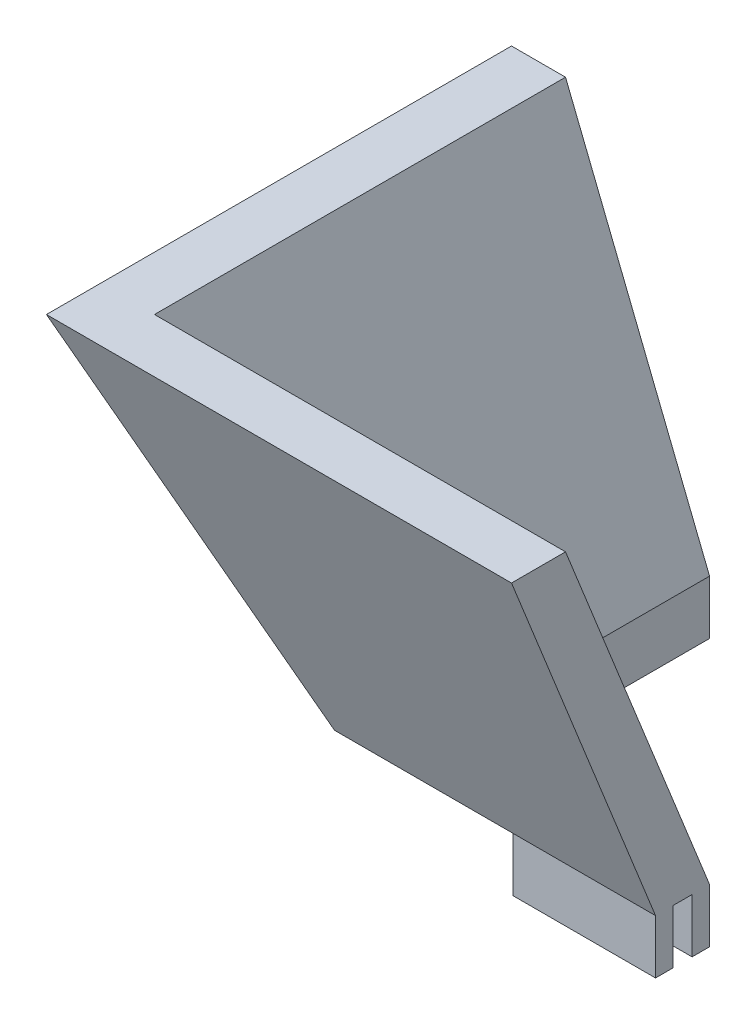
ISO-10303-21;
HEADER;
FILE_DESCRIPTION(('STEP AP214'),'2;1');
FILE_NAME('part.step','',(''),(''),'','','');
FILE_SCHEMA(('AUTOMOTIVE_DESIGN { 1 0 10303 214 1 1 1 1 }'));
ENDSEC;
DATA;
#1=APPLICATION_CONTEXT('core data for automotive mechanical design processes');
#2=APPLICATION_PROTOCOL_DEFINITION('international standard','automotive_design',2000,#1);
#3=PRODUCT_CONTEXT('',#1,'mechanical');
#4=PRODUCT('Part','Part','',(#3));
#5=PRODUCT_RELATED_PRODUCT_CATEGORY('part','',(#4));
#6=PRODUCT_DEFINITION_FORMATION('','',#4);
#7=PRODUCT_DEFINITION_CONTEXT('part definition',#1,'design');
#8=PRODUCT_DEFINITION('design','',#6,#7);
#9=PRODUCT_DEFINITION_SHAPE('','',#8);
#10=(LENGTH_UNIT() NAMED_UNIT(*) SI_UNIT(.MILLI.,.METRE.));
#11=(NAMED_UNIT(*) PLANE_ANGLE_UNIT() SI_UNIT($,.RADIAN.));
#12=(NAMED_UNIT(*) SI_UNIT($,.STERADIAN.) SOLID_ANGLE_UNIT());
#13=UNCERTAINTY_MEASURE_WITH_UNIT(LENGTH_MEASURE(1.E-05),#10,'distance_accuracy_value','');
#14=(GEOMETRIC_REPRESENTATION_CONTEXT(3) GLOBAL_UNCERTAINTY_ASSIGNED_CONTEXT((#13)) GLOBAL_UNIT_ASSIGNED_CONTEXT((#10,
#11,#12)) REPRESENTATION_CONTEXT('',''));
#15=CARTESIAN_POINT('',(0.,0.,0.));
#16=DIRECTION('',(0.,0.,1.));
#17=DIRECTION('',(1.,0.,0.));
#18=AXIS2_PLACEMENT_3D('',#15,#16,#17);
#19=CARTESIAN_POINT('',(0.,0.,0.));
#20=DIRECTION('',(0.,1.,0.));
#21=DIRECTION('',(0.,0.,1.));
#22=AXIS2_PLACEMENT_3D('',#19,#20,#21);
#23=PLANE('',#22);
#24=DIRECTION('',(0.,0.,-1.));
#25=VECTOR('',#24,1.);
#26=CARTESIAN_POINT('',(113.220499999994,0.,0.));
#27=LINE('',#26,#25);
#28=CARTESIAN_POINT('',(113.220499999994,0.,-6.15949999999999));
#29=VERTEX_POINT('',#28);
#30=CARTESIAN_POINT('',(113.220499999994,0.,-12.8905));
#31=VERTEX_POINT('',#30);
#32=EDGE_CURVE('E584',#29,#31,#27,.T.);
#33=ORIENTED_EDGE('',*,*,#32,.F.);
#34=DIRECTION('',(1.,0.,0.));
#35=VECTOR('',#34,1.);
#36=CARTESIAN_POINT('',(164.464999999989,0.,-6.15949999999999));
#37=LINE('',#36,#35);
#38=CARTESIAN_POINT('',(62.8649999999887,0.,-6.1595));
#39=VERTEX_POINT('',#38);
#40=EDGE_CURVE('E227',#39,#29,#37,.T.);
#41=ORIENTED_EDGE('',*,*,#40,.F.);
#42=DIRECTION('',(0.,0.,-1.));
#43=VECTOR('',#42,1.);
#44=CARTESIAN_POINT('',(62.8649999999887,0.,-6.1595));
#45=LINE('',#44,#43);
#46=CARTESIAN_POINT('',(62.8649999999887,0.,0.));
#47=VERTEX_POINT('',#46);
#48=EDGE_CURVE('E230',#47,#39,#45,.T.);
#49=ORIENTED_EDGE('',*,*,#48,.F.);
#50=DIRECTION('',(1.,0.,0.));
#51=VECTOR('',#50,1.);
#52=CARTESIAN_POINT('',(0.,0.,0.));
#53=LINE('',#52,#51);
#54=CARTESIAN_POINT('',(0.,0.,0.));
#55=VERTEX_POINT('',#54);
#56=EDGE_CURVE('E442',#55,#47,#53,.T.);
#57=ORIENTED_EDGE('',*,*,#56,.F.);
#58=DIRECTION('',(0.,0.,-1.));
#59=VECTOR('',#58,1.);
#60=CARTESIAN_POINT('',(0.,0.,0.));
#61=LINE('',#60,#59);
#62=CARTESIAN_POINT('',(0.,0.,-61.976));
#63=VERTEX_POINT('',#62);
#64=EDGE_CURVE('E67',#55,#63,#61,.T.);
#65=ORIENTED_EDGE('',*,*,#64,.T.);
#66=DIRECTION('',(-1.,0.,0.));
#67=VECTOR('',#66,1.);
#68=CARTESIAN_POINT('',(0.,0.,-61.976));
#69=LINE('',#68,#67);
#70=CARTESIAN_POINT('',(6.1595,0.,-61.976));
#71=VERTEX_POINT('',#70);
#72=EDGE_CURVE('E265',#71,#63,#69,.T.);
#73=ORIENTED_EDGE('',*,*,#72,.F.);
#74=DIRECTION('',(0.,0.,1.));
#75=VECTOR('',#74,1.);
#76=CARTESIAN_POINT('',(6.1595,0.,-61.976));
#77=LINE('',#76,#75);
#78=CARTESIAN_POINT('',(6.1595,0.,-113.220499999994));
#79=VERTEX_POINT('',#78);
#80=EDGE_CURVE('E263',#79,#71,#77,.T.);
#81=ORIENTED_EDGE('',*,*,#80,.F.);
#82=DIRECTION('',(-1.,0.,0.));
#83=VECTOR('',#82,1.);
#84=CARTESIAN_POINT('',(0.,0.,-113.220499999994));
#85=LINE('',#84,#83);
#86=CARTESIAN_POINT('',(12.8905,0.,-113.220499999994));
#87=VERTEX_POINT('',#86);
#88=EDGE_CURVE('E664',#87,#79,#85,.T.);
#89=ORIENTED_EDGE('',*,*,#88,.F.);
#90=DIRECTION('',(0.,0.,-1.));
#91=VECTOR('',#90,1.);
#92=CARTESIAN_POINT('',(12.8905,0.,-61.976));
#93=LINE('',#92,#91);
#94=CARTESIAN_POINT('',(12.8905,0.,-61.976));
#95=VERTEX_POINT('',#94);
#96=EDGE_CURVE('E244',#95,#87,#93,.T.);
#97=ORIENTED_EDGE('',*,*,#96,.F.);
#98=DIRECTION('',(-1.,0.,0.));
#99=VECTOR('',#98,1.);
#100=CARTESIAN_POINT('',(19.05,0.,-61.9759999999999));
#101=LINE('',#100,#99);
#102=CARTESIAN_POINT('',(19.05,0.,-61.9759999999999));
#103=VERTEX_POINT('',#102);
#104=EDGE_CURVE('E247',#103,#95,#101,.T.);
#105=ORIENTED_EDGE('',*,*,#104,.F.);
#106=DIRECTION('',(0.,0.,-1.));
#107=VECTOR('',#106,1.);
#108=CARTESIAN_POINT('',(19.05,0.,-19.05));
#109=LINE('',#108,#107);
#110=CARTESIAN_POINT('',(19.05,0.,-19.05));
#111=VERTEX_POINT('',#110);
#112=EDGE_CURVE('E550',#111,#103,#109,.T.);
#113=ORIENTED_EDGE('',*,*,#112,.F.);
#114=DIRECTION('',(-1.,0.,0.));
#115=VECTOR('',#114,1.);
#116=CARTESIAN_POINT('',(208.28,0.,-19.05));
#117=LINE('',#116,#115);
#118=CARTESIAN_POINT('',(62.8649999999887,0.,-19.05));
#119=VERTEX_POINT('',#118);
#120=EDGE_CURVE('E549',#119,#111,#117,.T.);
#121=ORIENTED_EDGE('',*,*,#120,.F.);
#122=DIRECTION('',(0.,0.,-1.));
#123=VECTOR('',#122,1.);
#124=CARTESIAN_POINT('',(62.8649999999888,0.,-12.8905));
#125=LINE('',#124,#123);
#126=CARTESIAN_POINT('',(62.8649999999888,0.,-12.8905));
#127=VERTEX_POINT('',#126);
#128=EDGE_CURVE('E226',#127,#119,#125,.T.);
#129=ORIENTED_EDGE('',*,*,#128,.F.);
#130=DIRECTION('',(-1.,0.,0.));
#131=VECTOR('',#130,1.);
#132=CARTESIAN_POINT('',(164.464999999989,0.,-12.8905));
#133=LINE('',#132,#131);
#134=EDGE_CURVE('E217',#31,#127,#133,.T.);
#135=ORIENTED_EDGE('',*,*,#134,.F.);
#136=EDGE_LOOP('',(#33,#41,#49,#57,#65,#73,#81,#89,#97,#105,#113,#121,#129,#135));
#137=FACE_BOUND('',#136,.T.);
#138=ADVANCED_FACE('F57',(#137),#23,.F.);
#139=CARTESIAN_POINT('',(0.,127.,0.));
#140=DIRECTION('',(0.,1.,0.));
#141=DIRECTION('',(0.,0.,1.));
#142=AXIS2_PLACEMENT_3D('',#139,#140,#141);
#143=PLANE('',#142);
#144=DIRECTION('',(1.,0.,0.));
#145=VECTOR('',#144,1.);
#146=CARTESIAN_POINT('',(-50.8,127.,50.8));
#147=LINE('',#146,#145);
#148=CARTESIAN_POINT('',(-50.8,127.,50.8));
#149=VERTEX_POINT('',#148);
#150=CARTESIAN_POINT('',(113.220499999994,127.,50.8));
#151=VERTEX_POINT('',#150);
#152=EDGE_CURVE('E376',#149,#151,#147,.T.);
#153=ORIENTED_EDGE('',*,*,#152,.T.);
#154=DIRECTION('',(0.,0.,-1.));
#155=VECTOR('',#154,1.);
#156=CARTESIAN_POINT('',(113.220499999994,127.,0.));
#157=LINE('',#156,#155);
#158=CARTESIAN_POINT('',(113.220499999994,127.,31.75));
#159=VERTEX_POINT('',#158);
#160=EDGE_CURVE('E586',#151,#159,#157,.T.);
#161=ORIENTED_EDGE('',*,*,#160,.T.);
#162=DIRECTION('',(1.,0.,0.));
#163=VECTOR('',#162,1.);
#164=CARTESIAN_POINT('',(-31.75,127.,31.75));
#165=LINE('',#164,#163);
#166=CARTESIAN_POINT('',(-31.75,127.,31.75));
#167=VERTEX_POINT('',#166);
#168=EDGE_CURVE('E377',#167,#159,#165,.T.);
#169=ORIENTED_EDGE('',*,*,#168,.F.);
#170=DIRECTION('',(0.,0.,1.));
#171=VECTOR('',#170,1.);
#172=CARTESIAN_POINT('',(-31.75,127.,-257.302));
#173=LINE('',#172,#171);
#174=CARTESIAN_POINT('',(-31.75,127.,-113.220499999994));
#175=VERTEX_POINT('',#174);
#176=EDGE_CURVE('E289',#175,#167,#173,.T.);
#177=ORIENTED_EDGE('',*,*,#176,.F.);
#178=DIRECTION('',(-1.,0.,0.));
#179=VECTOR('',#178,1.);
#180=CARTESIAN_POINT('',(278.13,127.,-113.220499999994));
#181=LINE('',#180,#179);
#182=CARTESIAN_POINT('',(-50.8,127.,-113.220499999994));
#183=VERTEX_POINT('',#182);
#184=EDGE_CURVE('E520',#175,#183,#181,.T.);
#185=ORIENTED_EDGE('',*,*,#184,.T.);
#186=DIRECTION('',(0.,0.,1.));
#187=VECTOR('',#186,1.);
#188=CARTESIAN_POINT('',(-50.8,127.,-276.352));
#189=LINE('',#188,#187);
#190=EDGE_CURVE('E374',#183,#149,#189,.T.);
#191=ORIENTED_EDGE('',*,*,#190,.T.);
#192=EDGE_LOOP('',(#153,#161,#169,#177,#185,#191));
#193=FACE_BOUND('',#192,.T.);
#194=ADVANCED_FACE('F417',(#193),#143,.T.);
#195=CARTESIAN_POINT('',(0.,0.,0.));
#196=DIRECTION('',(0.,-0.371390676354104,0.928476690885259));
#197=DIRECTION('',(0.,-0.928476690885259,-0.371390676354104));
#198=AXIS2_PLACEMENT_3D('',#195,#196,#197);
#199=PLANE('',#198);
#200=DIRECTION('',(-1.,0.,0.));
#201=VECTOR('',#200,1.);
#202=CARTESIAN_POINT('',(164.464999999989,0.,0.));
#203=LINE('',#202,#201);
#204=CARTESIAN_POINT('',(113.220499999994,0.,0.));
#205=VERTEX_POINT('',#204);
#206=EDGE_CURVE('E61',#205,#47,#203,.T.);
#207=ORIENTED_EDGE('',*,*,#206,.F.);
#208=DIRECTION('',(0.,0.928476690885259,0.371390676354104));
#209=VECTOR('',#208,1.);
#210=CARTESIAN_POINT('',(113.220499999994,0.,0.));
#211=LINE('',#210,#209);
#212=EDGE_CURVE('E894',#205,#151,#211,.T.);
#213=ORIENTED_EDGE('',*,*,#212,.T.);
#214=ORIENTED_EDGE('',*,*,#152,.F.);
#215=DIRECTION('',(0.348155311911396,-0.870388279778489,-0.348155311911396));
#216=VECTOR('',#215,1.);
#217=CARTESIAN_POINT('',(-50.8,127.,50.8));
#218=LINE('',#217,#216);
#219=EDGE_CURVE('E388',#149,#55,#218,.T.);
#220=ORIENTED_EDGE('',*,*,#219,.T.);
#221=ORIENTED_EDGE('',*,*,#56,.T.);
#222=EDGE_LOOP('',(#207,#213,#214,#220,#221));
#223=FACE_BOUND('',#222,.T.);
#224=ADVANCED_FACE('F407',(#223),#199,.T.);
#225=CARTESIAN_POINT('',(0.,6.56896551724138,-16.4224137931034));
#226=DIRECTION('',(0.,0.371390676354104,-0.928476690885259));
#227=DIRECTION('',(0.,0.928476690885259,0.371390676354104));
#228=AXIS2_PLACEMENT_3D('',#225,#226,#227);
#229=PLANE('',#228);
#230=ORIENTED_EDGE('',*,*,#168,.T.);
#231=DIRECTION('',(0.,-0.928476690885259,-0.371390676354104));
#232=VECTOR('',#231,1.);
#233=CARTESIAN_POINT('',(113.220499999994,6.56896551724138,-16.4224137931034));
#234=LINE('',#233,#232);
#235=CARTESIAN_POINT('',(113.220499999994,0.,-19.05));
#236=VERTEX_POINT('',#235);
#237=EDGE_CURVE('E209',#159,#236,#234,.T.);
#238=ORIENTED_EDGE('',*,*,#237,.T.);
#239=DIRECTION('',(1.,0.,0.));
#240=VECTOR('',#239,1.);
#241=CARTESIAN_POINT('',(164.464999999989,0.,-19.05));
#242=LINE('',#241,#240);
#243=EDGE_CURVE('E207',#119,#236,#242,.T.);
#244=ORIENTED_EDGE('',*,*,#243,.F.);
#245=ORIENTED_EDGE('',*,*,#120,.T.);
#246=DIRECTION('',(-0.348155311911396,0.870388279778489,0.348155311911396));
#247=VECTOR('',#246,1.);
#248=CARTESIAN_POINT('',(19.05,0.,-19.05));
#249=LINE('',#248,#247);
#250=EDGE_CURVE('E603',#111,#167,#249,.T.);
#251=ORIENTED_EDGE('',*,*,#250,.T.);
#252=EDGE_LOOP('',(#230,#238,#244,#245,#251));
#253=FACE_BOUND('',#252,.T.);
#254=ADVANCED_FACE('F416',(#253),#229,.T.);
#255=CARTESIAN_POINT('',(164.464999999989,-19.05,-6.15949999999999));
#256=DIRECTION('',(0.,0.,1.));
#257=DIRECTION('',(1.,0.,0.));
#258=AXIS2_PLACEMENT_3D('',#255,#256,#257);
#259=PLANE('',#258);
#260=DIRECTION('',(0.,1.,0.));
#261=VECTOR('',#260,1.);
#262=CARTESIAN_POINT('',(113.220499999994,-19.05,-6.15949999999999));
#263=LINE('',#262,#261);
#264=CARTESIAN_POINT('',(113.220499999994,-19.05,-6.15949999999999));
#265=VERTEX_POINT('',#264);
#266=EDGE_CURVE('E585',#265,#29,#263,.T.);
#267=ORIENTED_EDGE('',*,*,#266,.F.);
#268=DIRECTION('',(1.,0.,0.));
#269=VECTOR('',#268,1.);
#270=CARTESIAN_POINT('',(164.464999999989,-19.05,-6.15949999999999));
#271=LINE('',#270,#269);
#272=CARTESIAN_POINT('',(62.8649999999887,-19.05,-6.1595));
#273=VERTEX_POINT('',#272);
#274=EDGE_CURVE('E233',#273,#265,#271,.T.);
#275=ORIENTED_EDGE('',*,*,#274,.F.);
#276=DIRECTION('',(0.,1.,0.));
#277=VECTOR('',#276,1.);
#278=CARTESIAN_POINT('',(62.8649999999887,-19.05,-6.1595));
#279=LINE('',#278,#277);
#280=EDGE_CURVE('E223',#273,#39,#279,.T.);
#281=ORIENTED_EDGE('',*,*,#280,.T.);
#282=ORIENTED_EDGE('',*,*,#40,.T.);
#283=EDGE_LOOP('',(#267,#275,#281,#282));
#284=FACE_BOUND('',#283,.T.);
#285=ADVANCED_FACE('F320',(#284),#259,.F.);
#286=CARTESIAN_POINT('',(164.464999999989,-19.05,0.));
#287=DIRECTION('',(0.,0.,-1.));
#288=DIRECTION('',(-1.,0.,0.));
#289=AXIS2_PLACEMENT_3D('',#286,#287,#288);
#290=PLANE('',#289);
#291=DIRECTION('',(0.,-1.,0.));
#292=VECTOR('',#291,1.);
#293=CARTESIAN_POINT('',(113.220499999994,-19.05,0.));
#294=LINE('',#293,#292);
#295=CARTESIAN_POINT('',(113.220499999994,-19.05,0.));
#296=VERTEX_POINT('',#295);
#297=EDGE_CURVE('E885',#205,#296,#294,.T.);
#298=ORIENTED_EDGE('',*,*,#297,.F.);
#299=ORIENTED_EDGE('',*,*,#206,.T.);
#300=DIRECTION('',(0.,1.,0.));
#301=VECTOR('',#300,1.);
#302=CARTESIAN_POINT('',(62.8649999999887,-19.05,0.));
#303=LINE('',#302,#301);
#304=CARTESIAN_POINT('',(62.8649999999887,-19.05,0.));
#305=VERTEX_POINT('',#304);
#306=EDGE_CURVE('E225',#305,#47,#303,.T.);
#307=ORIENTED_EDGE('',*,*,#306,.F.);
#308=DIRECTION('',(-1.,0.,0.));
#309=VECTOR('',#308,1.);
#310=CARTESIAN_POINT('',(164.464999999989,-19.05,0.));
#311=LINE('',#310,#309);
#312=EDGE_CURVE('E231',#296,#305,#311,.T.);
#313=ORIENTED_EDGE('',*,*,#312,.F.);
#314=EDGE_LOOP('',(#298,#299,#307,#313));
#315=FACE_BOUND('',#314,.T.);
#316=ADVANCED_FACE('F309',(#315),#290,.F.);
#317=CARTESIAN_POINT('',(0.,-19.05,0.));
#318=DIRECTION('',(0.,-1.,0.));
#319=DIRECTION('',(0.,0.,-1.));
#320=AXIS2_PLACEMENT_3D('',#317,#318,#319);
#321=PLANE('',#320);
#322=ORIENTED_EDGE('',*,*,#274,.T.);
#323=DIRECTION('',(0.,0.,1.));
#324=VECTOR('',#323,1.);
#325=CARTESIAN_POINT('',(113.220499999994,-19.05,0.));
#326=LINE('',#325,#324);
#327=EDGE_CURVE('E891',#265,#296,#326,.T.);
#328=ORIENTED_EDGE('',*,*,#327,.T.);
#329=ORIENTED_EDGE('',*,*,#312,.T.);
#330=DIRECTION('',(0.,0.,-1.));
#331=VECTOR('',#330,1.);
#332=CARTESIAN_POINT('',(62.8649999999887,-19.05,-6.1595));
#333=LINE('',#332,#331);
#334=EDGE_CURVE('E236',#305,#273,#333,.T.);
#335=ORIENTED_EDGE('',*,*,#334,.T.);
#336=EDGE_LOOP('',(#322,#328,#329,#335));
#337=FACE_BOUND('',#336,.T.);
#338=ADVANCED_FACE('F319',(#337),#321,.T.);
#339=CARTESIAN_POINT('',(164.464999999989,-19.05,-19.05));
#340=DIRECTION('',(0.,0.,1.));
#341=DIRECTION('',(1.,0.,0.));
#342=AXIS2_PLACEMENT_3D('',#339,#340,#341);
#343=PLANE('',#342);
#344=DIRECTION('',(0.,1.,0.));
#345=VECTOR('',#344,1.);
#346=CARTESIAN_POINT('',(113.220499999994,-19.05,-19.05));
#347=LINE('',#346,#345);
#348=CARTESIAN_POINT('',(113.220499999994,-19.05,-19.05));
#349=VERTEX_POINT('',#348);
#350=EDGE_CURVE('E195',#349,#236,#347,.T.);
#351=ORIENTED_EDGE('',*,*,#350,.F.);
#352=DIRECTION('',(1.,0.,0.));
#353=VECTOR('',#352,1.);
#354=CARTESIAN_POINT('',(164.464999999989,-19.05,-19.05));
#355=LINE('',#354,#353);
#356=CARTESIAN_POINT('',(62.8649999999887,-19.05,-19.05));
#357=VERTEX_POINT('',#356);
#358=EDGE_CURVE('E204',#357,#349,#355,.T.);
#359=ORIENTED_EDGE('',*,*,#358,.F.);
#360=DIRECTION('',(0.,1.,0.));
#361=VECTOR('',#360,1.);
#362=CARTESIAN_POINT('',(62.8649999999887,-19.05,-19.05));
#363=LINE('',#362,#361);
#364=EDGE_CURVE('E523',#357,#119,#363,.T.);
#365=ORIENTED_EDGE('',*,*,#364,.T.);
#366=ORIENTED_EDGE('',*,*,#243,.T.);
#367=EDGE_LOOP('',(#351,#359,#365,#366));
#368=FACE_BOUND('',#367,.T.);
#369=ADVANCED_FACE('F202',(#368),#343,.F.);
#370=CARTESIAN_POINT('',(164.464999999989,-19.05,-12.8905));
#371=DIRECTION('',(0.,0.,-1.));
#372=DIRECTION('',(-1.,0.,0.));
#373=AXIS2_PLACEMENT_3D('',#370,#371,#372);
#374=PLANE('',#373);
#375=DIRECTION('',(0.,-1.,0.));
#376=VECTOR('',#375,1.);
#377=CARTESIAN_POINT('',(113.220499999994,-19.05,-12.8905));
#378=LINE('',#377,#376);
#379=CARTESIAN_POINT('',(113.220499999994,-19.05,-12.8905));
#380=VERTEX_POINT('',#379);
#381=EDGE_CURVE('E74',#31,#380,#378,.T.);
#382=ORIENTED_EDGE('',*,*,#381,.F.);
#383=ORIENTED_EDGE('',*,*,#134,.T.);
#384=DIRECTION('',(0.,1.,0.));
#385=VECTOR('',#384,1.);
#386=CARTESIAN_POINT('',(62.8649999999888,-19.05,-12.8905));
#387=LINE('',#386,#385);
#388=CARTESIAN_POINT('',(62.8649999999888,-19.05,-12.8905));
#389=VERTEX_POINT('',#388);
#390=EDGE_CURVE('E219',#389,#127,#387,.T.);
#391=ORIENTED_EDGE('',*,*,#390,.F.);
#392=DIRECTION('',(-1.,0.,0.));
#393=VECTOR('',#392,1.);
#394=CARTESIAN_POINT('',(164.464999999989,-19.05,-12.8905));
#395=LINE('',#394,#393);
#396=EDGE_CURVE('E215',#380,#389,#395,.T.);
#397=ORIENTED_EDGE('',*,*,#396,.F.);
#398=EDGE_LOOP('',(#382,#383,#391,#397));
#399=FACE_BOUND('',#398,.T.);
#400=ADVANCED_FACE('F565',(#399),#374,.F.);
#401=CARTESIAN_POINT('',(0.,-19.05,0.));
#402=DIRECTION('',(0.,1.,0.));
#403=DIRECTION('',(0.,0.,1.));
#404=AXIS2_PLACEMENT_3D('',#401,#402,#403);
#405=PLANE('',#404);
#406=DIRECTION('',(0.,0.,-1.));
#407=VECTOR('',#406,1.);
#408=CARTESIAN_POINT('',(113.220499999994,-19.05,0.));
#409=LINE('',#408,#407);
#410=EDGE_CURVE('E12',#380,#349,#409,.T.);
#411=ORIENTED_EDGE('',*,*,#410,.F.);
#412=ORIENTED_EDGE('',*,*,#396,.T.);
#413=DIRECTION('',(0.,0.,-1.));
#414=VECTOR('',#413,1.);
#415=CARTESIAN_POINT('',(62.8649999999888,-19.05,-12.8905));
#416=LINE('',#415,#414);
#417=EDGE_CURVE('E213',#389,#357,#416,.T.);
#418=ORIENTED_EDGE('',*,*,#417,.T.);
#419=ORIENTED_EDGE('',*,*,#358,.T.);
#420=EDGE_LOOP('',(#411,#412,#418,#419));
#421=FACE_BOUND('',#420,.T.);
#422=ADVANCED_FACE('F211',(#421),#405,.F.);
#423=CARTESIAN_POINT('',(0.,0.,0.));
#424=DIRECTION('',(0.928476690885259,0.371390676354104,0.));
#425=DIRECTION('',(-0.371390676354104,0.928476690885259,0.));
#426=AXIS2_PLACEMENT_3D('',#423,#424,#425);
#427=PLANE('',#426);
#428=DIRECTION('',(-0.371390676354104,0.928476690885259,0.));
#429=VECTOR('',#428,1.);
#430=CARTESIAN_POINT('',(0.,0.,-113.220499999994));
#431=LINE('',#430,#429);
#432=CARTESIAN_POINT('',(0.,0.,-113.220499999994));
#433=VERTEX_POINT('',#432);
#434=EDGE_CURVE('E522',#433,#183,#431,.T.);
#435=ORIENTED_EDGE('',*,*,#434,.F.);
#436=DIRECTION('',(0.,0.,-1.));
#437=VECTOR('',#436,1.);
#438=CARTESIAN_POINT('',(0.,0.,-61.976));
#439=LINE('',#438,#437);
#440=EDGE_CURVE('E257',#63,#433,#439,.T.);
#441=ORIENTED_EDGE('',*,*,#440,.F.);
#442=ORIENTED_EDGE('',*,*,#64,.F.);
#443=ORIENTED_EDGE('',*,*,#219,.F.);
#444=ORIENTED_EDGE('',*,*,#190,.F.);
#445=EDGE_LOOP('',(#435,#441,#442,#443,#444));
#446=FACE_BOUND('',#445,.T.);
#447=ADVANCED_FACE('F418',(#446),#427,.F.);
#448=CARTESIAN_POINT('',(16.4224137931034,6.56896551724138,0.));
#449=DIRECTION('',(0.928476690885259,0.371390676354104,0.));
#450=DIRECTION('',(-0.371390676354104,0.928476690885259,0.));
#451=AXIS2_PLACEMENT_3D('',#448,#449,#450);
#452=PLANE('',#451);
#453=DIRECTION('',(0.,0.,1.));
#454=VECTOR('',#453,1.);
#455=CARTESIAN_POINT('',(19.05,0.,-61.9759999999999));
#456=LINE('',#455,#454);
#457=CARTESIAN_POINT('',(19.05,0.,-113.220499999994));
#458=VERTEX_POINT('',#457);
#459=EDGE_CURVE('E266',#458,#103,#456,.T.);
#460=ORIENTED_EDGE('',*,*,#459,.F.);
#461=DIRECTION('',(-0.371390676354104,0.928476690885259,0.));
#462=VECTOR('',#461,1.);
#463=CARTESIAN_POINT('',(16.4224137931034,6.56896551724138,-113.220499999994));
#464=LINE('',#463,#462);
#465=EDGE_CURVE('E654',#458,#175,#464,.T.);
#466=ORIENTED_EDGE('',*,*,#465,.T.);
#467=ORIENTED_EDGE('',*,*,#176,.T.);
#468=ORIENTED_EDGE('',*,*,#250,.F.);
#469=ORIENTED_EDGE('',*,*,#112,.T.);
#470=EDGE_LOOP('',(#460,#466,#467,#468,#469));
#471=FACE_BOUND('',#470,.T.);
#472=ADVANCED_FACE('F423',(#471),#452,.T.);
#473=CARTESIAN_POINT('',(6.1595,-19.05,-61.976));
#474=DIRECTION('',(-1.,0.,0.));
#475=DIRECTION('',(0.,0.,1.));
#476=AXIS2_PLACEMENT_3D('',#473,#474,#475);
#477=PLANE('',#476);
#478=DIRECTION('',(0.,-1.,0.));
#479=VECTOR('',#478,1.);
#480=CARTESIAN_POINT('',(6.1595,-19.05,-113.220499999994));
#481=LINE('',#480,#479);
#482=CARTESIAN_POINT('',(6.1595,-19.05,-113.220499999994));
#483=VERTEX_POINT('',#482);
#484=EDGE_CURVE('E666',#79,#483,#481,.T.);
#485=ORIENTED_EDGE('',*,*,#484,.F.);
#486=ORIENTED_EDGE('',*,*,#80,.T.);
#487=DIRECTION('',(0.,1.,0.));
#488=VECTOR('',#487,1.);
#489=CARTESIAN_POINT('',(6.1595,-19.05,-61.976));
#490=LINE('',#489,#488);
#491=CARTESIAN_POINT('',(6.1595,-19.05,-61.976));
#492=VERTEX_POINT('',#491);
#493=EDGE_CURVE('E269',#492,#71,#490,.T.);
#494=ORIENTED_EDGE('',*,*,#493,.F.);
#495=DIRECTION('',(0.,0.,1.));
#496=VECTOR('',#495,1.);
#497=CARTESIAN_POINT('',(6.1595,-19.05,-61.976));
#498=LINE('',#497,#496);
#499=EDGE_CURVE('E254',#483,#492,#498,.T.);
#500=ORIENTED_EDGE('',*,*,#499,.F.);
#501=EDGE_LOOP('',(#485,#486,#494,#500));
#502=FACE_BOUND('',#501,.T.);
#503=ADVANCED_FACE('F351',(#502),#477,.F.);
#504=CARTESIAN_POINT('',(0.,-19.05,-61.976));
#505=DIRECTION('',(1.,0.,0.));
#506=DIRECTION('',(0.,0.,-1.));
#507=AXIS2_PLACEMENT_3D('',#504,#505,#506);
#508=PLANE('',#507);
#509=DIRECTION('',(0.,1.,0.));
#510=VECTOR('',#509,1.);
#511=CARTESIAN_POINT('',(0.,-19.05,-113.220499999994));
#512=LINE('',#511,#510);
#513=CARTESIAN_POINT('',(0.,-19.05,-113.220499999994));
#514=VERTEX_POINT('',#513);
#515=EDGE_CURVE('E524',#514,#433,#512,.T.);
#516=ORIENTED_EDGE('',*,*,#515,.F.);
#517=DIRECTION('',(0.,0.,-1.));
#518=VECTOR('',#517,1.);
#519=CARTESIAN_POINT('',(0.,-19.05,-61.976));
#520=LINE('',#519,#518);
#521=CARTESIAN_POINT('',(0.,-19.05,-61.976));
#522=VERTEX_POINT('',#521);
#523=EDGE_CURVE('E259',#522,#514,#520,.T.);
#524=ORIENTED_EDGE('',*,*,#523,.F.);
#525=DIRECTION('',(0.,1.,0.));
#526=VECTOR('',#525,1.);
#527=CARTESIAN_POINT('',(0.,-19.05,-61.976));
#528=LINE('',#527,#526);
#529=EDGE_CURVE('E262',#522,#63,#528,.T.);
#530=ORIENTED_EDGE('',*,*,#529,.T.);
#531=ORIENTED_EDGE('',*,*,#440,.T.);
#532=EDGE_LOOP('',(#516,#524,#530,#531));
#533=FACE_BOUND('',#532,.T.);
#534=ADVANCED_FACE('F346',(#533),#508,.F.);
#535=CARTESIAN_POINT('',(0.,-19.05,0.));
#536=DIRECTION('',(0.,-1.,0.));
#537=DIRECTION('',(0.,0.,-1.));
#538=AXIS2_PLACEMENT_3D('',#535,#536,#537);
#539=PLANE('',#538);
#540=ORIENTED_EDGE('',*,*,#523,.T.);
#541=DIRECTION('',(1.,0.,0.));
#542=VECTOR('',#541,1.);
#543=CARTESIAN_POINT('',(0.,-19.05,-113.220499999994));
#544=LINE('',#543,#542);
#545=EDGE_CURVE('E527',#514,#483,#544,.T.);
#546=ORIENTED_EDGE('',*,*,#545,.T.);
#547=ORIENTED_EDGE('',*,*,#499,.T.);
#548=DIRECTION('',(-1.,0.,0.));
#549=VECTOR('',#548,1.);
#550=CARTESIAN_POINT('',(0.,-19.05,-61.976));
#551=LINE('',#550,#549);
#552=EDGE_CURVE('E256',#492,#522,#551,.T.);
#553=ORIENTED_EDGE('',*,*,#552,.T.);
#554=EDGE_LOOP('',(#540,#546,#547,#553));
#555=FACE_BOUND('',#554,.T.);
#556=ADVANCED_FACE('F329',(#555),#539,.T.);
#557=CARTESIAN_POINT('',(19.05,-19.05,-61.9759999999999));
#558=DIRECTION('',(-1.,0.,0.));
#559=DIRECTION('',(0.,0.,1.));
#560=AXIS2_PLACEMENT_3D('',#557,#558,#559);
#561=PLANE('',#560);
#562=DIRECTION('',(0.,-1.,0.));
#563=VECTOR('',#562,1.);
#564=CARTESIAN_POINT('',(19.05,-19.05,-113.220499999994));
#565=LINE('',#564,#563);
#566=CARTESIAN_POINT('',(19.05,-19.05,-113.220499999994));
#567=VERTEX_POINT('',#566);
#568=EDGE_CURVE('E82',#458,#567,#565,.T.);
#569=ORIENTED_EDGE('',*,*,#568,.F.);
#570=ORIENTED_EDGE('',*,*,#459,.T.);
#571=DIRECTION('',(0.,1.,0.));
#572=VECTOR('',#571,1.);
#573=CARTESIAN_POINT('',(19.05,-19.05,-61.9759999999999));
#574=LINE('',#573,#572);
#575=CARTESIAN_POINT('',(19.05,-19.05,-61.9759999999999));
#576=VERTEX_POINT('',#575);
#577=EDGE_CURVE('E243',#576,#103,#574,.T.);
#578=ORIENTED_EDGE('',*,*,#577,.F.);
#579=DIRECTION('',(0.,0.,1.));
#580=VECTOR('',#579,1.);
#581=CARTESIAN_POINT('',(19.05,-19.05,-61.9759999999999));
#582=LINE('',#581,#580);
#583=EDGE_CURVE('E248',#567,#576,#582,.T.);
#584=ORIENTED_EDGE('',*,*,#583,.F.);
#585=EDGE_LOOP('',(#569,#570,#578,#584));
#586=FACE_BOUND('',#585,.T.);
#587=ADVANCED_FACE('F324',(#586),#561,.F.);
#588=CARTESIAN_POINT('',(12.8905,-19.05,-61.976));
#589=DIRECTION('',(1.,0.,0.));
#590=DIRECTION('',(0.,0.,-1.));
#591=AXIS2_PLACEMENT_3D('',#588,#589,#590);
#592=PLANE('',#591);
#593=DIRECTION('',(0.,1.,0.));
#594=VECTOR('',#593,1.);
#595=CARTESIAN_POINT('',(12.8905,-19.05,-113.220499999994));
#596=LINE('',#595,#594);
#597=CARTESIAN_POINT('',(12.8905,-19.05,-113.220499999994));
#598=VERTEX_POINT('',#597);
#599=EDGE_CURVE('E651',#598,#87,#596,.T.);
#600=ORIENTED_EDGE('',*,*,#599,.F.);
#601=DIRECTION('',(0.,0.,-1.));
#602=VECTOR('',#601,1.);
#603=CARTESIAN_POINT('',(12.8905,-19.05,-61.976));
#604=LINE('',#603,#602);
#605=CARTESIAN_POINT('',(12.8905,-19.05,-61.976));
#606=VERTEX_POINT('',#605);
#607=EDGE_CURVE('E242',#606,#598,#604,.T.);
#608=ORIENTED_EDGE('',*,*,#607,.F.);
#609=DIRECTION('',(0.,1.,0.));
#610=VECTOR('',#609,1.);
#611=CARTESIAN_POINT('',(12.8905,-19.05,-61.976));
#612=LINE('',#611,#610);
#613=EDGE_CURVE('E239',#606,#95,#612,.T.);
#614=ORIENTED_EDGE('',*,*,#613,.T.);
#615=ORIENTED_EDGE('',*,*,#96,.T.);
#616=EDGE_LOOP('',(#600,#608,#614,#615));
#617=FACE_BOUND('',#616,.T.);
#618=ADVANCED_FACE('F328',(#617),#592,.F.);
#619=CARTESIAN_POINT('',(0.,-19.05,0.));
#620=DIRECTION('',(0.,1.,0.));
#621=DIRECTION('',(0.,0.,1.));
#622=AXIS2_PLACEMENT_3D('',#619,#620,#621);
#623=PLANE('',#622);
#624=DIRECTION('',(-1.,0.,0.));
#625=VECTOR('',#624,1.);
#626=CARTESIAN_POINT('',(0.,-19.05,-113.220499999994));
#627=LINE('',#626,#625);
#628=EDGE_CURVE('E652',#567,#598,#627,.T.);
#629=ORIENTED_EDGE('',*,*,#628,.F.);
#630=ORIENTED_EDGE('',*,*,#583,.T.);
#631=DIRECTION('',(-1.,0.,0.));
#632=VECTOR('',#631,1.);
#633=CARTESIAN_POINT('',(19.05,-19.05,-61.9759999999999));
#634=LINE('',#633,#632);
#635=EDGE_CURVE('E251',#576,#606,#634,.T.);
#636=ORIENTED_EDGE('',*,*,#635,.T.);
#637=ORIENTED_EDGE('',*,*,#607,.T.);
#638=EDGE_LOOP('',(#629,#630,#636,#637));
#639=FACE_BOUND('',#638,.T.);
#640=ADVANCED_FACE('F339',(#639),#623,.F.);
#641=CARTESIAN_POINT('',(0.,-19.05,-61.976));
#642=DIRECTION('',(0.,0.,-1.));
#643=DIRECTION('',(-1.,0.,0.));
#644=AXIS2_PLACEMENT_3D('',#641,#642,#643);
#645=PLANE('',#644);
#646=ORIENTED_EDGE('',*,*,#72,.T.);
#647=ORIENTED_EDGE('',*,*,#529,.F.);
#648=ORIENTED_EDGE('',*,*,#552,.F.);
#649=ORIENTED_EDGE('',*,*,#493,.T.);
#650=EDGE_LOOP('',(#646,#647,#648,#649));
#651=FACE_BOUND('',#650,.T.);
#652=ADVANCED_FACE('F335',(#651),#645,.F.);
#653=CARTESIAN_POINT('',(19.05,-19.05,-61.9759999999999));
#654=DIRECTION('',(0.,0.,-1.));
#655=DIRECTION('',(-1.,0.,0.));
#656=AXIS2_PLACEMENT_3D('',#653,#654,#655);
#657=PLANE('',#656);
#658=ORIENTED_EDGE('',*,*,#104,.T.);
#659=ORIENTED_EDGE('',*,*,#613,.F.);
#660=ORIENTED_EDGE('',*,*,#635,.F.);
#661=ORIENTED_EDGE('',*,*,#577,.T.);
#662=EDGE_LOOP('',(#658,#659,#660,#661));
#663=FACE_BOUND('',#662,.T.);
#664=ADVANCED_FACE('F331',(#663),#657,.F.);
#665=CARTESIAN_POINT('',(62.8649999999887,-19.05,-6.1595));
#666=DIRECTION('',(1.,0.,0.));
#667=DIRECTION('',(0.,0.,-1.));
#668=AXIS2_PLACEMENT_3D('',#665,#666,#667);
#669=PLANE('',#668);
#670=ORIENTED_EDGE('',*,*,#48,.T.);
#671=ORIENTED_EDGE('',*,*,#280,.F.);
#672=ORIENTED_EDGE('',*,*,#334,.F.);
#673=ORIENTED_EDGE('',*,*,#306,.T.);
#674=EDGE_LOOP('',(#670,#671,#672,#673));
#675=FACE_BOUND('',#674,.T.);
#676=ADVANCED_FACE('F334',(#675),#669,.F.);
#677=CARTESIAN_POINT('',(62.8649999999888,-19.05,-12.8905));
#678=DIRECTION('',(1.,0.,0.));
#679=DIRECTION('',(0.,0.,-1.));
#680=AXIS2_PLACEMENT_3D('',#677,#678,#679);
#681=PLANE('',#680);
#682=ORIENTED_EDGE('',*,*,#128,.T.);
#683=ORIENTED_EDGE('',*,*,#364,.F.);
#684=ORIENTED_EDGE('',*,*,#417,.F.);
#685=ORIENTED_EDGE('',*,*,#390,.T.);
#686=EDGE_LOOP('',(#682,#683,#684,#685));
#687=FACE_BOUND('',#686,.T.);
#688=ADVANCED_FACE('F566',(#687),#681,.F.);
#689=CARTESIAN_POINT('',(0.,0.,-113.220499999994));
#690=DIRECTION('',(0.,0.,-1.));
#691=DIRECTION('',(-1.,0.,0.));
#692=AXIS2_PLACEMENT_3D('',#689,#690,#691);
#693=PLANE('',#692);
#694=ORIENTED_EDGE('',*,*,#434,.T.);
#695=ORIENTED_EDGE('',*,*,#184,.F.);
#696=ORIENTED_EDGE('',*,*,#465,.F.);
#697=ORIENTED_EDGE('',*,*,#568,.T.);
#698=ORIENTED_EDGE('',*,*,#628,.T.);
#699=ORIENTED_EDGE('',*,*,#599,.T.);
#700=ORIENTED_EDGE('',*,*,#88,.T.);
#701=ORIENTED_EDGE('',*,*,#484,.T.);
#702=ORIENTED_EDGE('',*,*,#545,.F.);
#703=ORIENTED_EDGE('',*,*,#515,.T.);
#704=EDGE_LOOP('',(#694,#695,#696,#697,#698,#699,#700,#701,#702,#703));
#705=FACE_BOUND('',#704,.T.);
#706=ADVANCED_FACE('F576',(#705),#693,.T.);
#707=CARTESIAN_POINT('',(113.220499999994,0.,0.));
#708=DIRECTION('',(1.,0.,0.));
#709=DIRECTION('',(0.,0.,-1.));
#710=AXIS2_PLACEMENT_3D('',#707,#708,#709);
#711=PLANE('',#710);
#712=ORIENTED_EDGE('',*,*,#297,.T.);
#713=ORIENTED_EDGE('',*,*,#327,.F.);
#714=ORIENTED_EDGE('',*,*,#266,.T.);
#715=ORIENTED_EDGE('',*,*,#32,.T.);
#716=ORIENTED_EDGE('',*,*,#381,.T.);
#717=ORIENTED_EDGE('',*,*,#410,.T.);
#718=ORIENTED_EDGE('',*,*,#350,.T.);
#719=ORIENTED_EDGE('',*,*,#237,.F.);
#720=ORIENTED_EDGE('',*,*,#160,.F.);
#721=ORIENTED_EDGE('',*,*,#212,.F.);
#722=EDGE_LOOP('',(#712,#713,#714,#715,#716,#717,#718,#719,#720,#721));
#723=FACE_BOUND('',#722,.T.);
#724=ADVANCED_FACE('F194',(#723),#711,.T.);
#725=CLOSED_SHELL('',(#138,#194,#224,#254,#285,#316,#338,#369,#400,#422,#447,#472,#503,#534,
#556,#587,#618,#640,#652,#664,#676,#688,#706,#724));
#726=MANIFOLD_SOLID_BREP('B2',#725);
#727=ADVANCED_BREP_SHAPE_REPRESENTATION('',(#18,#726),#14);
#728=SHAPE_DEFINITION_REPRESENTATION(#9,#727);
ENDSEC;
END-ISO-10303-21;
